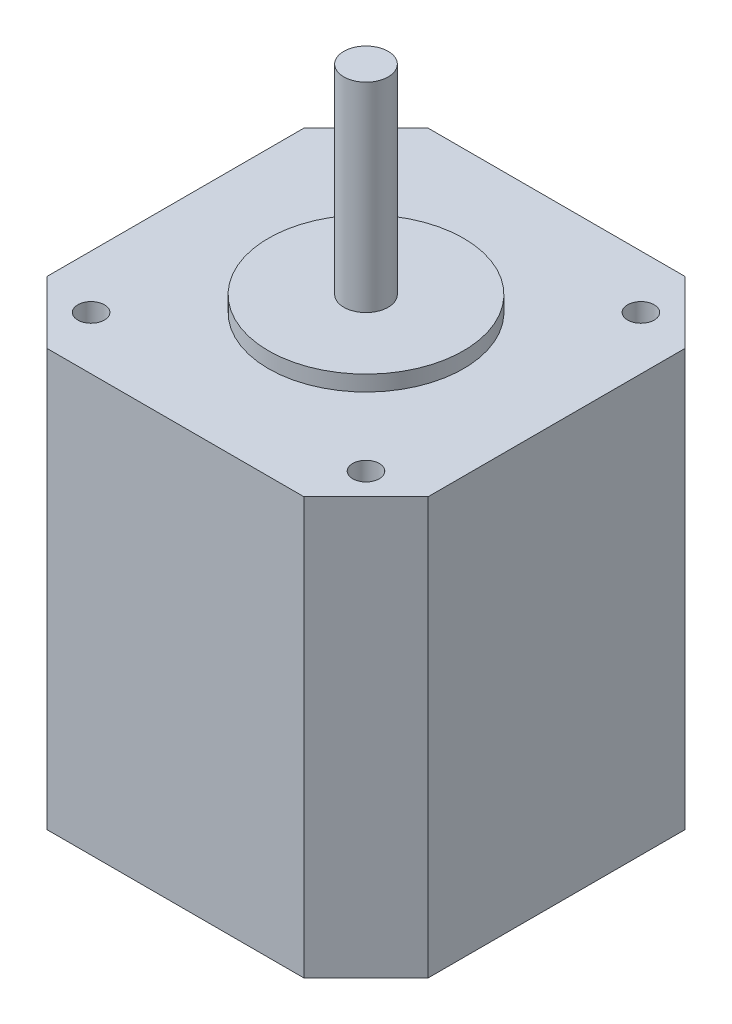
ISO-10303-21;
HEADER;
FILE_DESCRIPTION(('STEP AP214'),'2;1');
FILE_NAME('part.step','',(''),(''),'','','');
FILE_SCHEMA(('AUTOMOTIVE_DESIGN { 1 0 10303 214 1 1 1 1 }'));
ENDSEC;
DATA;
#1=APPLICATION_CONTEXT('core data for automotive mechanical design processes');
#2=APPLICATION_PROTOCOL_DEFINITION('international standard','automotive_design',2000,#1);
#3=PRODUCT_CONTEXT('',#1,'mechanical');
#4=PRODUCT('Part','Part','',(#3));
#5=PRODUCT_RELATED_PRODUCT_CATEGORY('part','',(#4));
#6=PRODUCT_DEFINITION_FORMATION('','',#4);
#7=PRODUCT_DEFINITION_CONTEXT('part definition',#1,'design');
#8=PRODUCT_DEFINITION('design','',#6,#7);
#9=PRODUCT_DEFINITION_SHAPE('','',#8);
#10=(LENGTH_UNIT() NAMED_UNIT(*) SI_UNIT(.MILLI.,.METRE.));
#11=(NAMED_UNIT(*) PLANE_ANGLE_UNIT() SI_UNIT($,.RADIAN.));
#12=(NAMED_UNIT(*) SI_UNIT($,.STERADIAN.) SOLID_ANGLE_UNIT());
#13=UNCERTAINTY_MEASURE_WITH_UNIT(LENGTH_MEASURE(1.E-05),#10,'distance_accuracy_value','');
#14=(GEOMETRIC_REPRESENTATION_CONTEXT(3) GLOBAL_UNCERTAINTY_ASSIGNED_CONTEXT((#13)) GLOBAL_UNIT_ASSIGNED_CONTEXT((#10,
#11,#12)) REPRESENTATION_CONTEXT('',''));
#15=CARTESIAN_POINT('',(0.,0.,0.));
#16=DIRECTION('',(0.,0.,1.));
#17=DIRECTION('',(1.,0.,0.));
#18=AXIS2_PLACEMENT_3D('',#15,#16,#17);
#19=CARTESIAN_POINT('',(49.,-216.5,-49.));
#20=DIRECTION('',(0.,1.,0.));
#21=DIRECTION('',(0.,0.,1.));
#22=AXIS2_PLACEMENT_3D('',#19,#20,#21);
#23=CYLINDRICAL_SURFACE('',#22,2.5);
#24=CARTESIAN_POINT('',(49.,-216.5,-49.));
#25=DIRECTION('',(0.,-1.,0.));
#26=DIRECTION('',(0.,0.,-1.));
#27=AXIS2_PLACEMENT_3D('',#24,#25,#26);
#28=CIRCLE('',#27,2.5);
#29=CARTESIAN_POINT('',(49.,-216.5,-46.5));
#30=VERTEX_POINT('',#29);
#31=EDGE_CURVE('E11',#30,#30,#28,.T.);
#32=CARTESIAN_POINT('',(49.,-194.,-49.));
#33=DIRECTION('',(0.,-1.,0.));
#34=DIRECTION('',(0.,0.,-1.));
#35=AXIS2_PLACEMENT_3D('',#32,#33,#34);
#36=CIRCLE('',#35,2.5);
#37=CARTESIAN_POINT('',(49.,-194.,-46.5));
#38=VERTEX_POINT('',#37);
#39=EDGE_CURVE('E36',#38,#38,#36,.T.);
#40=CARTESIAN_POINT('',(49.,-216.5,-46.5));
#41=CARTESIAN_POINT('',(49.,-216.265625,-46.5));
#42=CARTESIAN_POINT('',(49.,-216.03125,-46.5));
#43=CARTESIAN_POINT('',(49.,-215.5625,-46.5));
#44=CARTESIAN_POINT('',(49.,-215.328125,-46.5));
#45=CARTESIAN_POINT('',(49.,-214.859375,-46.5));
#46=CARTESIAN_POINT('',(49.,-214.625,-46.5));
#47=CARTESIAN_POINT('',(49.,-214.15625,-46.5));
#48=CARTESIAN_POINT('',(49.,-213.921875,-46.5));
#49=CARTESIAN_POINT('',(49.,-213.453125,-46.5));
#50=CARTESIAN_POINT('',(49.,-213.21875,-46.5));
#51=CARTESIAN_POINT('',(49.,-212.75,-46.5));
#52=CARTESIAN_POINT('',(49.,-212.515625,-46.5));
#53=CARTESIAN_POINT('',(49.,-212.046875,-46.5));
#54=CARTESIAN_POINT('',(49.,-211.8125,-46.5));
#55=CARTESIAN_POINT('',(49.,-211.34375,-46.5));
#56=CARTESIAN_POINT('',(49.,-211.109375,-46.5));
#57=CARTESIAN_POINT('',(49.,-210.640625,-46.5));
#58=CARTESIAN_POINT('',(49.,-210.40625,-46.5));
#59=CARTESIAN_POINT('',(49.,-209.9375,-46.5));
#60=CARTESIAN_POINT('',(49.,-209.703125,-46.5));
#61=CARTESIAN_POINT('',(49.,-209.234375,-46.5));
#62=CARTESIAN_POINT('',(49.,-209.,-46.5));
#63=CARTESIAN_POINT('',(49.,-208.53125,-46.5));
#64=CARTESIAN_POINT('',(49.,-208.296875,-46.5));
#65=CARTESIAN_POINT('',(49.,-207.828125,-46.5));
#66=CARTESIAN_POINT('',(49.,-207.59375,-46.5));
#67=CARTESIAN_POINT('',(49.,-207.125,-46.5));
#68=CARTESIAN_POINT('',(49.,-206.890625,-46.5));
#69=CARTESIAN_POINT('',(49.,-206.421875,-46.5));
#70=CARTESIAN_POINT('',(49.,-206.1875,-46.5));
#71=CARTESIAN_POINT('',(49.,-205.71875,-46.5));
#72=CARTESIAN_POINT('',(49.,-205.484375,-46.5));
#73=CARTESIAN_POINT('',(49.,-205.015625,-46.5));
#74=CARTESIAN_POINT('',(49.,-204.78125,-46.5));
#75=CARTESIAN_POINT('',(49.,-204.3125,-46.5));
#76=CARTESIAN_POINT('',(49.,-204.078125,-46.5));
#77=CARTESIAN_POINT('',(49.,-203.609375,-46.5));
#78=CARTESIAN_POINT('',(49.,-203.375,-46.5));
#79=CARTESIAN_POINT('',(49.,-202.90625,-46.5));
#80=CARTESIAN_POINT('',(49.,-202.671875,-46.5));
#81=CARTESIAN_POINT('',(49.,-202.203125,-46.5));
#82=CARTESIAN_POINT('',(49.,-201.96875,-46.5));
#83=CARTESIAN_POINT('',(49.,-201.5,-46.5));
#84=CARTESIAN_POINT('',(49.,-201.265625,-46.5));
#85=CARTESIAN_POINT('',(49.,-200.796875,-46.5));
#86=CARTESIAN_POINT('',(49.,-200.5625,-46.5));
#87=CARTESIAN_POINT('',(49.,-200.09375,-46.5));
#88=CARTESIAN_POINT('',(49.,-199.859375,-46.5));
#89=CARTESIAN_POINT('',(49.,-199.390625,-46.5));
#90=CARTESIAN_POINT('',(49.,-199.15625,-46.5));
#91=CARTESIAN_POINT('',(49.,-198.6875,-46.5));
#92=CARTESIAN_POINT('',(49.,-198.453125,-46.5));
#93=CARTESIAN_POINT('',(49.,-197.984375,-46.5));
#94=CARTESIAN_POINT('',(49.,-197.75,-46.5));
#95=CARTESIAN_POINT('',(49.,-197.28125,-46.5));
#96=CARTESIAN_POINT('',(49.,-197.046875,-46.5));
#97=CARTESIAN_POINT('',(49.,-196.578125,-46.5));
#98=CARTESIAN_POINT('',(49.,-196.34375,-46.5));
#99=CARTESIAN_POINT('',(49.,-195.875,-46.5));
#100=CARTESIAN_POINT('',(49.,-195.640625,-46.5));
#101=CARTESIAN_POINT('',(49.,-195.171875,-46.5));
#102=CARTESIAN_POINT('',(49.,-194.9375,-46.5));
#103=CARTESIAN_POINT('',(49.,-194.46875,-46.5));
#104=CARTESIAN_POINT('',(49.,-194.234375,-46.5));
#105=CARTESIAN_POINT('',(49.,-194.,-46.5));
#106=B_SPLINE_CURVE_WITH_KNOTS('',3,(#40,#41,#42,#43,#44,#45,#46,#47,#48,#49,#50,#51,#52,#53,
#54,#55,#56,#57,#58,#59,#60,#61,#62,#63,#64,#65,#66,#67,#68,#69,#70,#71,#72,#73,#74,#75,#76,#77,
#78,#79,#80,#81,#82,#83,#84,#85,#86,#87,#88,#89,#90,#91,#92,#93,#94,#95,#96,#97,#98,#99,#100,
#101,#102,#103,#104,#105),.UNSPECIFIED.,.F.,.F.,(4,2,2,2,2,2,2,2,2,2,2,2,2,2,2,2,2,2,2,2,2,2,2,
2,2,2,2,2,2,2,2,2,4),(0.,0.703125000000027,1.40625000000003,2.10937500000002,2.81250000000002,
3.51562500000002,4.21875000000002,4.92187500000002,5.62500000000002,6.32812500000002,
7.03125000000002,7.73437500000002,8.43750000000001,9.14062500000001,9.84375000000001,10.546875,
11.25,11.953125,12.65625,13.359375,14.0625,14.765625,15.46875,16.171875,16.875,17.578125,
18.28125,18.984375,19.6875,20.390625,21.09375,21.796875,22.5),.UNSPECIFIED.);
#107=EDGE_CURVE('BSEAM33',#30,#38,#106,.T.);
#108=ORIENTED_EDGE('',*,*,#31,.F.);
#109=ORIENTED_EDGE('',*,*,#39,.T.);
#110=ORIENTED_EDGE('',*,*,#107,.T.);
#111=ORIENTED_EDGE('',*,*,#107,.F.);
#112=EDGE_LOOP('',(#108,#110,#109,#111));
#113=FACE_BOUND('',#112,.T.);
#114=ADVANCED_FACE('F33',(#113),#23,.T.);
#115=CARTESIAN_POINT('',(49.,-194.,-49.));
#116=DIRECTION('',(0.,-1.,0.));
#117=DIRECTION('',(0.,0.,-1.));
#118=AXIS2_PLACEMENT_3D('',#115,#116,#117);
#119=PLANE('',#118);
#120=ORIENTED_EDGE('',*,*,#39,.F.);
#121=EDGE_LOOP('',(#120));
#122=FACE_BOUND('',#121,.T.);
#123=ADVANCED_FACE('F172',(#122),#119,.F.);
#124=CARTESIAN_POINT('',(49.,-216.5,-49.));
#125=DIRECTION('',(0.,-1.,0.));
#126=DIRECTION('',(0.,0.,-1.));
#127=AXIS2_PLACEMENT_3D('',#124,#125,#126);
#128=PLANE('',#127);
#129=CARTESIAN_POINT('',(49.,-216.5,-49.));
#130=DIRECTION('',(0.,-1.,0.));
#131=DIRECTION('',(0.,0.,-1.));
#132=AXIS2_PLACEMENT_3D('',#129,#130,#131);
#133=CIRCLE('',#132,11.);
#134=CARTESIAN_POINT('',(49.,-216.5,-60.));
#135=VERTEX_POINT('',#134);
#136=EDGE_CURVE('E160',#135,#135,#133,.T.);
#137=ORIENTED_EDGE('',*,*,#136,.F.);
#138=EDGE_LOOP('',(#137));
#139=FACE_BOUND('',#138,.T.);
#140=ORIENTED_EDGE('',*,*,#31,.T.);
#141=EDGE_LOOP('',(#140));
#142=FACE_BOUND('',#141,.T.);
#143=ADVANCED_FACE('F169',(#139,#142),#128,.F.);
#144=CARTESIAN_POINT('',(49.,-218.25,-49.));
#145=DIRECTION('',(0.,1.,0.));
#146=DIRECTION('',(0.,0.,1.));
#147=AXIS2_PLACEMENT_3D('',#144,#145,#146);
#148=CYLINDRICAL_SURFACE('',#147,11.);
#149=CARTESIAN_POINT('',(49.,-218.25,-49.));
#150=DIRECTION('',(0.,-1.,0.));
#151=DIRECTION('',(0.,0.,-1.));
#152=AXIS2_PLACEMENT_3D('',#149,#150,#151);
#153=CIRCLE('',#152,11.);
#154=CARTESIAN_POINT('',(49.,-218.25,-60.));
#155=VERTEX_POINT('',#154);
#156=EDGE_CURVE('E161',#155,#155,#153,.T.);
#157=ORIENTED_EDGE('',*,*,#156,.F.);
#158=EDGE_LOOP('',(#157));
#159=FACE_BOUND('',#158,.T.);
#160=ORIENTED_EDGE('',*,*,#136,.T.);
#161=EDGE_LOOP('',(#160));
#162=FACE_BOUND('',#161,.T.);
#163=ADVANCED_FACE('F167',(#159,#162),#148,.T.);
#164=CARTESIAN_POINT('',(0.,-218.25,0.));
#165=DIRECTION('',(0.,1.,0.));
#166=DIRECTION('',(0.,0.,1.));
#167=AXIS2_PLACEMENT_3D('',#164,#165,#166);
#168=PLANE('',#167);
#169=CARTESIAN_POINT('',(64.5000000000003,-218.25,-33.5));
#170=DIRECTION('',(0.,1.,0.));
#171=DIRECTION('',(0.,0.,1.));
#172=AXIS2_PLACEMENT_3D('',#169,#170,#171);
#173=CIRCLE('',#172,1.5);
#174=CARTESIAN_POINT('',(64.5000000000003,-218.25,-32.));
#175=VERTEX_POINT('',#174);
#176=EDGE_CURVE('E244',#175,#175,#173,.T.);
#177=ORIENTED_EDGE('',*,*,#176,.F.);
#178=EDGE_LOOP('',(#177));
#179=FACE_BOUND('',#178,.T.);
#180=CARTESIAN_POINT('',(33.5000000000003,-218.25,-33.4999999999998));
#181=DIRECTION('',(0.,1.,0.));
#182=DIRECTION('',(0.,0.,1.));
#183=AXIS2_PLACEMENT_3D('',#180,#181,#182);
#184=CIRCLE('',#183,1.5);
#185=CARTESIAN_POINT('',(33.5000000000003,-218.25,-31.9999999999998));
#186=VERTEX_POINT('',#185);
#187=EDGE_CURVE('E246',#186,#186,#184,.T.);
#188=ORIENTED_EDGE('',*,*,#187,.F.);
#189=EDGE_LOOP('',(#188));
#190=FACE_BOUND('',#189,.T.);
#191=CARTESIAN_POINT('',(33.5,-218.25,-64.4999999999998));
#192=DIRECTION('',(0.,1.,0.));
#193=DIRECTION('',(0.,0.,1.));
#194=AXIS2_PLACEMENT_3D('',#191,#192,#193);
#195=CIRCLE('',#194,1.5);
#196=CARTESIAN_POINT('',(33.5,-218.25,-62.9999999999998));
#197=VERTEX_POINT('',#196);
#198=EDGE_CURVE('E252',#197,#197,#195,.T.);
#199=ORIENTED_EDGE('',*,*,#198,.F.);
#200=EDGE_LOOP('',(#199));
#201=FACE_BOUND('',#200,.T.);
#202=CARTESIAN_POINT('',(64.5,-218.25,-64.5));
#203=DIRECTION('',(0.,1.,0.));
#204=DIRECTION('',(0.,0.,1.));
#205=AXIS2_PLACEMENT_3D('',#202,#203,#204);
#206=CIRCLE('',#205,1.5);
#207=CARTESIAN_POINT('',(64.5,-218.25,-63.));
#208=VERTEX_POINT('',#207);
#209=EDGE_CURVE('E258',#208,#208,#206,.T.);
#210=ORIENTED_EDGE('',*,*,#209,.F.);
#211=EDGE_LOOP('',(#210));
#212=FACE_BOUND('',#211,.T.);
#213=DIRECTION('',(-0.707106781186548,0.,-0.707106781186547));
#214=VECTOR('',#213,1.);
#215=CARTESIAN_POINT('',(27.5,-218.25,-34.5));
#216=LINE('',#215,#214);
#217=CARTESIAN_POINT('',(34.5,-218.25,-27.5));
#218=VERTEX_POINT('',#217);
#219=CARTESIAN_POINT('',(27.5,-218.25,-34.5));
#220=VERTEX_POINT('',#219);
#221=EDGE_CURVE('E130',#218,#220,#216,.T.);
#222=ORIENTED_EDGE('',*,*,#221,.F.);
#223=DIRECTION('',(-1.,0.,0.));
#224=VECTOR('',#223,1.);
#225=CARTESIAN_POINT('',(34.5,-218.25,-27.5));
#226=LINE('',#225,#224);
#227=CARTESIAN_POINT('',(63.5,-218.25,-27.5));
#228=VERTEX_POINT('',#227);
#229=EDGE_CURVE('E84',#228,#218,#226,.T.);
#230=ORIENTED_EDGE('',*,*,#229,.F.);
#231=DIRECTION('',(-0.707106781186548,0.,0.707106781186547));
#232=VECTOR('',#231,1.);
#233=CARTESIAN_POINT('',(63.5,-218.25,-27.5));
#234=LINE('',#233,#232);
#235=CARTESIAN_POINT('',(70.5,-218.25,-34.5));
#236=VERTEX_POINT('',#235);
#237=EDGE_CURVE('E78',#236,#228,#234,.T.);
#238=ORIENTED_EDGE('',*,*,#237,.F.);
#239=DIRECTION('',(0.,0.,1.));
#240=VECTOR('',#239,1.);
#241=CARTESIAN_POINT('',(70.5,-218.25,-34.5));
#242=LINE('',#241,#240);
#243=CARTESIAN_POINT('',(70.5,-218.25,-63.5));
#244=VERTEX_POINT('',#243);
#245=EDGE_CURVE('E120',#244,#236,#242,.T.);
#246=ORIENTED_EDGE('',*,*,#245,.F.);
#247=DIRECTION('',(0.707106781186547,0.,0.707106781186547));
#248=VECTOR('',#247,1.);
#249=CARTESIAN_POINT('',(63.5,-218.25,-70.5));
#250=LINE('',#249,#248);
#251=CARTESIAN_POINT('',(63.5,-218.25,-70.5));
#252=VERTEX_POINT('',#251);
#253=EDGE_CURVE('E140',#252,#244,#250,.T.);
#254=ORIENTED_EDGE('',*,*,#253,.F.);
#255=DIRECTION('',(1.,0.,0.));
#256=VECTOR('',#255,1.);
#257=CARTESIAN_POINT('',(34.5,-218.25,-70.5));
#258=LINE('',#257,#256);
#259=CARTESIAN_POINT('',(34.5,-218.25,-70.5));
#260=VERTEX_POINT('',#259);
#261=EDGE_CURVE('E138',#260,#252,#258,.T.);
#262=ORIENTED_EDGE('',*,*,#261,.F.);
#263=DIRECTION('',(0.707106781186547,0.,-0.707106781186548));
#264=VECTOR('',#263,1.);
#265=CARTESIAN_POINT('',(27.5,-218.25,-63.5));
#266=LINE('',#265,#264);
#267=CARTESIAN_POINT('',(27.5,-218.25,-63.5));
#268=VERTEX_POINT('',#267);
#269=EDGE_CURVE('E136',#268,#260,#266,.T.);
#270=ORIENTED_EDGE('',*,*,#269,.F.);
#271=DIRECTION('',(0.,0.,-1.));
#272=VECTOR('',#271,1.);
#273=CARTESIAN_POINT('',(27.5,-218.25,-34.5));
#274=LINE('',#273,#272);
#275=EDGE_CURVE('E133',#220,#268,#274,.T.);
#276=ORIENTED_EDGE('',*,*,#275,.F.);
#277=EDGE_LOOP('',(#222,#230,#238,#246,#254,#262,#270,#276));
#278=FACE_BOUND('',#277,.T.);
#279=ORIENTED_EDGE('',*,*,#156,.T.);
#280=EDGE_LOOP('',(#279));
#281=FACE_BOUND('',#280,.T.);
#282=ADVANCED_FACE('F186',(#179,#190,#201,#212,#278,#281),#168,.T.);
#283=CARTESIAN_POINT('',(27.5,-265.25,-34.5));
#284=DIRECTION('',(0.707106781186547,0.,-0.707106781186548));
#285=DIRECTION('',(-0.707106781186548,0.,-0.707106781186547));
#286=AXIS2_PLACEMENT_3D('',#283,#284,#285);
#287=PLANE('',#286);
#288=ORIENTED_EDGE('',*,*,#221,.T.);
#289=DIRECTION('',(0.,1.,0.));
#290=VECTOR('',#289,1.);
#291=CARTESIAN_POINT('',(27.5,-265.25,-34.5));
#292=LINE('',#291,#290);
#293=CARTESIAN_POINT('',(27.5,-265.25,-34.5));
#294=VERTEX_POINT('',#293);
#295=EDGE_CURVE('E158',#294,#220,#292,.T.);
#296=ORIENTED_EDGE('',*,*,#295,.F.);
#297=DIRECTION('',(-0.707106781186548,0.,-0.707106781186547));
#298=VECTOR('',#297,1.);
#299=CARTESIAN_POINT('',(27.5,-265.25,-34.5));
#300=LINE('',#299,#298);
#301=CARTESIAN_POINT('',(34.5,-265.25,-27.5));
#302=VERTEX_POINT('',#301);
#303=EDGE_CURVE('E145',#302,#294,#300,.T.);
#304=ORIENTED_EDGE('',*,*,#303,.F.);
#305=DIRECTION('',(0.,1.,0.));
#306=VECTOR('',#305,1.);
#307=CARTESIAN_POINT('',(34.5,-265.25,-27.5));
#308=LINE('',#307,#306);
#309=EDGE_CURVE('E126',#302,#218,#308,.T.);
#310=ORIENTED_EDGE('',*,*,#309,.T.);
#311=EDGE_LOOP('',(#288,#296,#304,#310));
#312=FACE_BOUND('',#311,.T.);
#313=ADVANCED_FACE('F189',(#312),#287,.F.);
#314=CARTESIAN_POINT('',(27.5,-265.25,-34.5));
#315=DIRECTION('',(1.,0.,0.));
#316=DIRECTION('',(0.,0.,-1.));
#317=AXIS2_PLACEMENT_3D('',#314,#315,#316);
#318=PLANE('',#317);
#319=ORIENTED_EDGE('',*,*,#275,.T.);
#320=DIRECTION('',(0.,1.,0.));
#321=VECTOR('',#320,1.);
#322=CARTESIAN_POINT('',(27.5,-265.25,-63.5));
#323=LINE('',#322,#321);
#324=CARTESIAN_POINT('',(27.5,-265.25,-63.5));
#325=VERTEX_POINT('',#324);
#326=EDGE_CURVE('E155',#325,#268,#323,.T.);
#327=ORIENTED_EDGE('',*,*,#326,.F.);
#328=DIRECTION('',(0.,0.,-1.));
#329=VECTOR('',#328,1.);
#330=CARTESIAN_POINT('',(27.5,-265.25,-34.5));
#331=LINE('',#330,#329);
#332=EDGE_CURVE('E93',#294,#325,#331,.T.);
#333=ORIENTED_EDGE('',*,*,#332,.F.);
#334=ORIENTED_EDGE('',*,*,#295,.T.);
#335=EDGE_LOOP('',(#319,#327,#333,#334));
#336=FACE_BOUND('',#335,.T.);
#337=ADVANCED_FACE('F192',(#336),#318,.F.);
#338=CARTESIAN_POINT('',(27.5,-265.25,-63.5));
#339=DIRECTION('',(0.707106781186548,0.,0.707106781186547));
#340=DIRECTION('',(0.707106781186547,0.,-0.707106781186548));
#341=AXIS2_PLACEMENT_3D('',#338,#339,#340);
#342=PLANE('',#341);
#343=ORIENTED_EDGE('',*,*,#269,.T.);
#344=DIRECTION('',(0.,1.,0.));
#345=VECTOR('',#344,1.);
#346=CARTESIAN_POINT('',(34.5,-265.25,-70.5));
#347=LINE('',#346,#345);
#348=CARTESIAN_POINT('',(34.5,-265.25,-70.5));
#349=VERTEX_POINT('',#348);
#350=EDGE_CURVE('E152',#349,#260,#347,.T.);
#351=ORIENTED_EDGE('',*,*,#350,.F.);
#352=DIRECTION('',(0.707106781186547,0.,-0.707106781186548));
#353=VECTOR('',#352,1.);
#354=CARTESIAN_POINT('',(27.5,-265.25,-63.5));
#355=LINE('',#354,#353);
#356=EDGE_CURVE('E267',#325,#349,#355,.T.);
#357=ORIENTED_EDGE('',*,*,#356,.F.);
#358=ORIENTED_EDGE('',*,*,#326,.T.);
#359=EDGE_LOOP('',(#343,#351,#357,#358));
#360=FACE_BOUND('',#359,.T.);
#361=ADVANCED_FACE('F196',(#360),#342,.F.);
#362=CARTESIAN_POINT('',(34.5,-265.25,-70.5));
#363=DIRECTION('',(0.,0.,1.));
#364=DIRECTION('',(1.,0.,0.));
#365=AXIS2_PLACEMENT_3D('',#362,#363,#364);
#366=PLANE('',#365);
#367=ORIENTED_EDGE('',*,*,#261,.T.);
#368=DIRECTION('',(0.,1.,0.));
#369=VECTOR('',#368,1.);
#370=CARTESIAN_POINT('',(63.5,-265.25,-70.5));
#371=LINE('',#370,#369);
#372=CARTESIAN_POINT('',(63.5,-265.25,-70.5));
#373=VERTEX_POINT('',#372);
#374=EDGE_CURVE('E149',#373,#252,#371,.T.);
#375=ORIENTED_EDGE('',*,*,#374,.F.);
#376=DIRECTION('',(1.,0.,0.));
#377=VECTOR('',#376,1.);
#378=CARTESIAN_POINT('',(34.5,-265.25,-70.5));
#379=LINE('',#378,#377);
#380=EDGE_CURVE('E269',#349,#373,#379,.T.);
#381=ORIENTED_EDGE('',*,*,#380,.F.);
#382=ORIENTED_EDGE('',*,*,#350,.T.);
#383=EDGE_LOOP('',(#367,#375,#381,#382));
#384=FACE_BOUND('',#383,.T.);
#385=ADVANCED_FACE('F199',(#384),#366,.F.);
#386=CARTESIAN_POINT('',(63.5,-265.25,-70.5));
#387=DIRECTION('',(-0.707106781186547,0.,0.707106781186547));
#388=DIRECTION('',(0.707106781186548,0.,0.707106781186548));
#389=AXIS2_PLACEMENT_3D('',#386,#387,#388);
#390=PLANE('',#389);
#391=ORIENTED_EDGE('',*,*,#253,.T.);
#392=DIRECTION('',(0.,1.,0.));
#393=VECTOR('',#392,1.);
#394=CARTESIAN_POINT('',(70.5,-265.25,-63.5));
#395=LINE('',#394,#393);
#396=CARTESIAN_POINT('',(70.5,-265.25,-63.5));
#397=VERTEX_POINT('',#396);
#398=EDGE_CURVE('E121',#397,#244,#395,.T.);
#399=ORIENTED_EDGE('',*,*,#398,.F.);
#400=DIRECTION('',(0.707106781186547,0.,0.707106781186547));
#401=VECTOR('',#400,1.);
#402=CARTESIAN_POINT('',(63.5,-265.25,-70.5));
#403=LINE('',#402,#401);
#404=EDGE_CURVE('E112',#373,#397,#403,.T.);
#405=ORIENTED_EDGE('',*,*,#404,.F.);
#406=ORIENTED_EDGE('',*,*,#374,.T.);
#407=EDGE_LOOP('',(#391,#399,#405,#406));
#408=FACE_BOUND('',#407,.T.);
#409=ADVANCED_FACE('F203',(#408),#390,.F.);
#410=CARTESIAN_POINT('',(70.5,-265.25,-34.5));
#411=DIRECTION('',(-1.,0.,0.));
#412=DIRECTION('',(0.,0.,1.));
#413=AXIS2_PLACEMENT_3D('',#410,#411,#412);
#414=PLANE('',#413);
#415=ORIENTED_EDGE('',*,*,#245,.T.);
#416=DIRECTION('',(0.,1.,0.));
#417=VECTOR('',#416,1.);
#418=CARTESIAN_POINT('',(70.5,-265.25,-34.5));
#419=LINE('',#418,#417);
#420=CARTESIAN_POINT('',(70.5,-265.25,-34.5));
#421=VERTEX_POINT('',#420);
#422=EDGE_CURVE('E117',#421,#236,#419,.T.);
#423=ORIENTED_EDGE('',*,*,#422,.F.);
#424=DIRECTION('',(0.,0.,1.));
#425=VECTOR('',#424,1.);
#426=CARTESIAN_POINT('',(70.5,-265.25,-34.5));
#427=LINE('',#426,#425);
#428=EDGE_CURVE('E106',#397,#421,#427,.T.);
#429=ORIENTED_EDGE('',*,*,#428,.F.);
#430=ORIENTED_EDGE('',*,*,#398,.T.);
#431=EDGE_LOOP('',(#415,#423,#429,#430));
#432=FACE_BOUND('',#431,.T.);
#433=ADVANCED_FACE('F118',(#432),#414,.F.);
#434=CARTESIAN_POINT('',(63.5,-265.25,-27.5));
#435=DIRECTION('',(-0.707106781186547,0.,-0.707106781186548));
#436=DIRECTION('',(-0.707106781186548,0.,0.707106781186547));
#437=AXIS2_PLACEMENT_3D('',#434,#435,#436);
#438=PLANE('',#437);
#439=ORIENTED_EDGE('',*,*,#237,.T.);
#440=DIRECTION('',(0.,1.,0.));
#441=VECTOR('',#440,1.);
#442=CARTESIAN_POINT('',(63.5,-265.25,-27.5));
#443=LINE('',#442,#441);
#444=CARTESIAN_POINT('',(63.5,-265.25,-27.5));
#445=VERTEX_POINT('',#444);
#446=EDGE_CURVE('E122',#445,#228,#443,.T.);
#447=ORIENTED_EDGE('',*,*,#446,.F.);
#448=DIRECTION('',(-0.707106781186548,0.,0.707106781186547));
#449=VECTOR('',#448,1.);
#450=CARTESIAN_POINT('',(63.5,-265.25,-27.5));
#451=LINE('',#450,#449);
#452=EDGE_CURVE('E110',#421,#445,#451,.T.);
#453=ORIENTED_EDGE('',*,*,#452,.F.);
#454=ORIENTED_EDGE('',*,*,#422,.T.);
#455=EDGE_LOOP('',(#439,#447,#453,#454));
#456=FACE_BOUND('',#455,.T.);
#457=ADVANCED_FACE('F124',(#456),#438,.F.);
#458=CARTESIAN_POINT('',(34.5,-265.25,-27.5));
#459=DIRECTION('',(0.,0.,-1.));
#460=DIRECTION('',(-1.,0.,0.));
#461=AXIS2_PLACEMENT_3D('',#458,#459,#460);
#462=PLANE('',#461);
#463=ORIENTED_EDGE('',*,*,#229,.T.);
#464=ORIENTED_EDGE('',*,*,#309,.F.);
#465=DIRECTION('',(-1.,0.,0.));
#466=VECTOR('',#465,1.);
#467=CARTESIAN_POINT('',(34.5,-265.25,-27.5));
#468=LINE('',#467,#466);
#469=EDGE_CURVE('E49',#445,#302,#468,.T.);
#470=ORIENTED_EDGE('',*,*,#469,.F.);
#471=ORIENTED_EDGE('',*,*,#446,.T.);
#472=EDGE_LOOP('',(#463,#464,#470,#471));
#473=FACE_BOUND('',#472,.T.);
#474=ADVANCED_FACE('F212',(#473),#462,.F.);
#475=CARTESIAN_POINT('',(0.,-265.25,0.));
#476=DIRECTION('',(0.,1.,0.));
#477=DIRECTION('',(0.,0.,1.));
#478=AXIS2_PLACEMENT_3D('',#475,#476,#477);
#479=PLANE('',#478);
#480=CARTESIAN_POINT('',(64.5000000000003,-265.25,-33.5));
#481=DIRECTION('',(0.,1.,0.));
#482=DIRECTION('',(0.,0.,1.));
#483=AXIS2_PLACEMENT_3D('',#480,#481,#482);
#484=CIRCLE('',#483,1.5);
#485=CARTESIAN_POINT('',(64.5000000000003,-265.25,-32.));
#486=VERTEX_POINT('',#485);
#487=EDGE_CURVE('E241',#486,#486,#484,.T.);
#488=ORIENTED_EDGE('',*,*,#487,.T.);
#489=EDGE_LOOP('',(#488));
#490=FACE_BOUND('',#489,.T.);
#491=CARTESIAN_POINT('',(33.5000000000003,-265.25,-33.4999999999998));
#492=DIRECTION('',(0.,1.,0.));
#493=DIRECTION('',(0.,0.,1.));
#494=AXIS2_PLACEMENT_3D('',#491,#492,#493);
#495=CIRCLE('',#494,1.5);
#496=CARTESIAN_POINT('',(33.5000000000003,-265.25,-31.9999999999998));
#497=VERTEX_POINT('',#496);
#498=EDGE_CURVE('E249',#497,#497,#495,.T.);
#499=ORIENTED_EDGE('',*,*,#498,.T.);
#500=EDGE_LOOP('',(#499));
#501=FACE_BOUND('',#500,.T.);
#502=CARTESIAN_POINT('',(33.5,-265.25,-64.4999999999998));
#503=DIRECTION('',(0.,1.,0.));
#504=DIRECTION('',(0.,0.,1.));
#505=AXIS2_PLACEMENT_3D('',#502,#503,#504);
#506=CIRCLE('',#505,1.5);
#507=CARTESIAN_POINT('',(33.5,-265.25,-62.9999999999998));
#508=VERTEX_POINT('',#507);
#509=EDGE_CURVE('E255',#508,#508,#506,.T.);
#510=ORIENTED_EDGE('',*,*,#509,.T.);
#511=EDGE_LOOP('',(#510));
#512=FACE_BOUND('',#511,.T.);
#513=CARTESIAN_POINT('',(64.5,-265.25,-64.5));
#514=DIRECTION('',(0.,1.,0.));
#515=DIRECTION('',(0.,0.,1.));
#516=AXIS2_PLACEMENT_3D('',#513,#514,#515);
#517=CIRCLE('',#516,1.5);
#518=CARTESIAN_POINT('',(64.5,-265.25,-63.));
#519=VERTEX_POINT('',#518);
#520=EDGE_CURVE('E134',#519,#519,#517,.T.);
#521=ORIENTED_EDGE('',*,*,#520,.T.);
#522=EDGE_LOOP('',(#521));
#523=FACE_BOUND('',#522,.T.);
#524=ORIENTED_EDGE('',*,*,#303,.T.);
#525=ORIENTED_EDGE('',*,*,#332,.T.);
#526=ORIENTED_EDGE('',*,*,#356,.T.);
#527=ORIENTED_EDGE('',*,*,#380,.T.);
#528=ORIENTED_EDGE('',*,*,#404,.T.);
#529=ORIENTED_EDGE('',*,*,#428,.T.);
#530=ORIENTED_EDGE('',*,*,#452,.T.);
#531=ORIENTED_EDGE('',*,*,#469,.T.);
#532=EDGE_LOOP('',(#524,#525,#526,#527,#528,#529,#530,#531));
#533=FACE_BOUND('',#532,.T.);
#534=ADVANCED_FACE('F108',(#490,#501,#512,#523,#533),#479,.F.);
#535=CARTESIAN_POINT('',(64.5,-265.25,-64.5));
#536=DIRECTION('',(0.,1.,0.));
#537=DIRECTION('',(0.,0.,1.));
#538=AXIS2_PLACEMENT_3D('',#535,#536,#537);
#539=CYLINDRICAL_SURFACE('',#538,1.5);
#540=ORIENTED_EDGE('',*,*,#520,.F.);
#541=EDGE_LOOP('',(#540));
#542=FACE_BOUND('',#541,.T.);
#543=ORIENTED_EDGE('',*,*,#209,.T.);
#544=EDGE_LOOP('',(#543));
#545=FACE_BOUND('',#544,.T.);
#546=ADVANCED_FACE('F220',(#542,#545),#539,.F.);
#547=CARTESIAN_POINT('',(33.5,-265.25,-64.4999999999998));
#548=DIRECTION('',(0.,1.,0.));
#549=DIRECTION('',(0.,0.,1.));
#550=AXIS2_PLACEMENT_3D('',#547,#548,#549);
#551=CYLINDRICAL_SURFACE('',#550,1.5);
#552=ORIENTED_EDGE('',*,*,#509,.F.);
#553=EDGE_LOOP('',(#552));
#554=FACE_BOUND('',#553,.T.);
#555=ORIENTED_EDGE('',*,*,#198,.T.);
#556=EDGE_LOOP('',(#555));
#557=FACE_BOUND('',#556,.T.);
#558=ADVANCED_FACE('F224',(#554,#557),#551,.F.);
#559=CARTESIAN_POINT('',(33.5000000000003,-265.25,-33.4999999999998));
#560=DIRECTION('',(0.,1.,0.));
#561=DIRECTION('',(0.,0.,1.));
#562=AXIS2_PLACEMENT_3D('',#559,#560,#561);
#563=CYLINDRICAL_SURFACE('',#562,1.5);
#564=ORIENTED_EDGE('',*,*,#498,.F.);
#565=EDGE_LOOP('',(#564));
#566=FACE_BOUND('',#565,.T.);
#567=ORIENTED_EDGE('',*,*,#187,.T.);
#568=EDGE_LOOP('',(#567));
#569=FACE_BOUND('',#568,.T.);
#570=ADVANCED_FACE('F228',(#566,#569),#563,.F.);
#571=CARTESIAN_POINT('',(64.5000000000003,-265.25,-33.5));
#572=DIRECTION('',(0.,1.,0.));
#573=DIRECTION('',(0.,0.,1.));
#574=AXIS2_PLACEMENT_3D('',#571,#572,#573);
#575=CYLINDRICAL_SURFACE('',#574,1.5);
#576=ORIENTED_EDGE('',*,*,#487,.F.);
#577=EDGE_LOOP('',(#576));
#578=FACE_BOUND('',#577,.T.);
#579=ORIENTED_EDGE('',*,*,#176,.T.);
#580=EDGE_LOOP('',(#579));
#581=FACE_BOUND('',#580,.T.);
#582=ADVANCED_FACE('F232',(#578,#581),#575,.F.);
#583=CLOSED_SHELL('',(#114,#123,#143,#163,#282,#313,#337,#361,#385,#409,#433,#457,#474,#534,
#546,#558,#570,#582));
#584=MANIFOLD_SOLID_BREP('B2',#583);
#585=ADVANCED_BREP_SHAPE_REPRESENTATION('',(#18,#584),#14);
#586=SHAPE_DEFINITION_REPRESENTATION(#9,#585);
ENDSEC;
END-ISO-10303-21;
